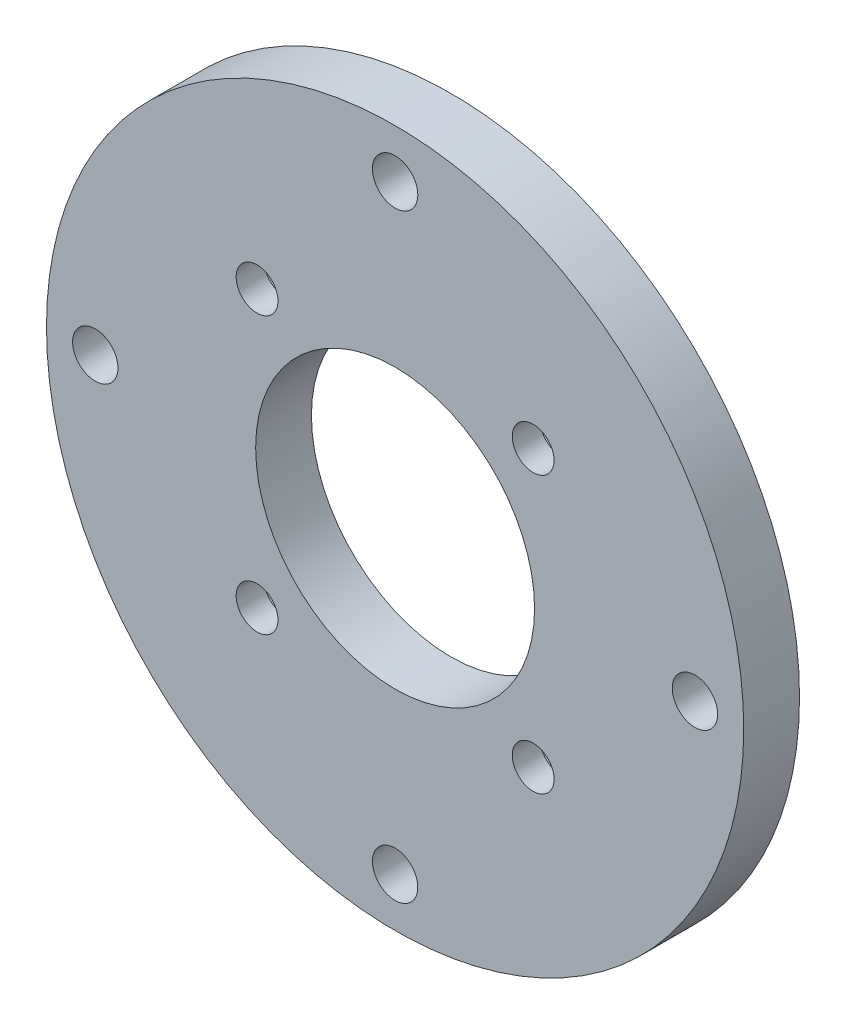
ISO-10303-21;
HEADER;
FILE_DESCRIPTION(('STEP AP214'),'2;1');
FILE_NAME('part.step','',(''),(''),'','','');
FILE_SCHEMA(('AUTOMOTIVE_DESIGN { 1 0 10303 214 1 1 1 1 }'));
ENDSEC;
DATA;
#1=APPLICATION_CONTEXT('core data for automotive mechanical design processes');
#2=APPLICATION_PROTOCOL_DEFINITION('international standard','automotive_design',2000,#1);
#3=PRODUCT_CONTEXT('',#1,'mechanical');
#4=PRODUCT('Part','Part','',(#3));
#5=PRODUCT_RELATED_PRODUCT_CATEGORY('part','',(#4));
#6=PRODUCT_DEFINITION_FORMATION('','',#4);
#7=PRODUCT_DEFINITION_CONTEXT('part definition',#1,'design');
#8=PRODUCT_DEFINITION('design','',#6,#7);
#9=PRODUCT_DEFINITION_SHAPE('','',#8);
#10=(LENGTH_UNIT() NAMED_UNIT(*) SI_UNIT(.MILLI.,.METRE.));
#11=(NAMED_UNIT(*) PLANE_ANGLE_UNIT() SI_UNIT($,.RADIAN.));
#12=(NAMED_UNIT(*) SI_UNIT($,.STERADIAN.) SOLID_ANGLE_UNIT());
#13=UNCERTAINTY_MEASURE_WITH_UNIT(LENGTH_MEASURE(1.E-05),#10,'distance_accuracy_value','');
#14=(GEOMETRIC_REPRESENTATION_CONTEXT(3) GLOBAL_UNCERTAINTY_ASSIGNED_CONTEXT((#13)) GLOBAL_UNIT_ASSIGNED_CONTEXT((#10,
#11,#12)) REPRESENTATION_CONTEXT('',''));
#15=CARTESIAN_POINT('',(0.,0.,0.));
#16=DIRECTION('',(0.,0.,1.));
#17=DIRECTION('',(1.,0.,0.));
#18=AXIS2_PLACEMENT_3D('',#15,#16,#17);
#19=CARTESIAN_POINT('',(0.,0.,20.));
#20=DIRECTION('',(0.,0.,-1.));
#21=DIRECTION('',(-1.,0.,0.));
#22=AXIS2_PLACEMENT_3D('',#19,#20,#21);
#23=CYLINDRICAL_SURFACE('',#22,125.);
#24=CARTESIAN_POINT('',(0.,0.,20.));
#25=DIRECTION('',(0.,0.,1.));
#26=DIRECTION('',(1.,0.,0.));
#27=AXIS2_PLACEMENT_3D('',#24,#25,#26);
#28=CIRCLE('',#27,125.);
#29=CARTESIAN_POINT('',(125.,0.,20.));
#30=VERTEX_POINT('',#29);
#31=EDGE_CURVE('E10',#30,#30,#28,.T.);
#32=ORIENTED_EDGE('',*,*,#31,.F.);
#33=EDGE_LOOP('',(#32));
#34=FACE_BOUND('',#33,.T.);
#35=CARTESIAN_POINT('',(0.,0.,0.));
#36=DIRECTION('',(0.,0.,1.));
#37=DIRECTION('',(1.,0.,0.));
#38=AXIS2_PLACEMENT_3D('',#35,#36,#37);
#39=CIRCLE('',#38,125.);
#40=CARTESIAN_POINT('',(125.,0.,0.));
#41=VERTEX_POINT('',#40);
#42=EDGE_CURVE('E35',#41,#41,#39,.T.);
#43=ORIENTED_EDGE('',*,*,#42,.T.);
#44=EDGE_LOOP('',(#43));
#45=FACE_BOUND('',#44,.T.);
#46=ADVANCED_FACE('F32',(#34,#45),#23,.T.);
#47=CARTESIAN_POINT('',(0.,0.,20.));
#48=DIRECTION('',(0.,0.,1.));
#49=DIRECTION('',(1.,0.,0.));
#50=AXIS2_PLACEMENT_3D('',#47,#48,#49);
#51=PLANE('',#50);
#52=CARTESIAN_POINT('',(-49.4974746830582,-49.4974746830585,20.));
#53=DIRECTION('',(0.,0.,-1.));
#54=DIRECTION('',(0.,-1.,0.));
#55=AXIS2_PLACEMENT_3D('',#52,#53,#54);
#56=CIRCLE('',#55,7.5);
#57=CARTESIAN_POINT('',(-49.4974746830581,-56.9974746830585,20.));
#58=VERTEX_POINT('',#57);
#59=EDGE_CURVE('E90',#58,#58,#56,.T.);
#60=ORIENTED_EDGE('',*,*,#59,.T.);
#61=EDGE_LOOP('',(#60));
#62=FACE_BOUND('',#61,.T.);
#63=CARTESIAN_POINT('',(49.4974746830583,-49.4974746830583,20.));
#64=DIRECTION('',(0.,0.,-1.));
#65=DIRECTION('',(1.,0.,0.));
#66=AXIS2_PLACEMENT_3D('',#63,#64,#65);
#67=CIRCLE('',#66,7.5);
#68=CARTESIAN_POINT('',(56.9974746830583,-49.4974746830583,20.));
#69=VERTEX_POINT('',#68);
#70=EDGE_CURVE('E113',#69,#69,#67,.T.);
#71=ORIENTED_EDGE('',*,*,#70,.T.);
#72=EDGE_LOOP('',(#71));
#73=FACE_BOUND('',#72,.T.);
#74=CARTESIAN_POINT('',(49.4974746830578,49.4974746830588,20.));
#75=DIRECTION('',(0.,0.,-1.));
#76=DIRECTION('',(0.,1.,0.));
#77=AXIS2_PLACEMENT_3D('',#74,#75,#76);
#78=CIRCLE('',#77,7.5);
#79=CARTESIAN_POINT('',(49.4974746830577,56.9974746830588,20.));
#80=VERTEX_POINT('',#79);
#81=EDGE_CURVE('E107',#80,#80,#78,.T.);
#82=ORIENTED_EDGE('',*,*,#81,.T.);
#83=EDGE_LOOP('',(#82));
#84=FACE_BOUND('',#83,.T.);
#85=CARTESIAN_POINT('',(-107.5,-3.75334243925637E-13,20.));
#86=DIRECTION('',(0.,0.,1.));
#87=DIRECTION('',(0.,1.,0.));
#88=AXIS2_PLACEMENT_3D('',#85,#86,#87);
#89=CIRCLE('',#88,8.1328201971002);
#90=CARTESIAN_POINT('',(-107.5,8.13282019709982,20.));
#91=VERTEX_POINT('',#90);
#92=EDGE_CURVE('E81',#91,#91,#89,.T.);
#93=ORIENTED_EDGE('',*,*,#92,.F.);
#94=EDGE_LOOP('',(#93));
#95=FACE_BOUND('',#94,.T.);
#96=CARTESIAN_POINT('',(0.,-107.5,20.));
#97=DIRECTION('',(0.,0.,1.));
#98=DIRECTION('',(-1.,0.,0.));
#99=AXIS2_PLACEMENT_3D('',#96,#97,#98);
#100=CIRCLE('',#99,8.1328201971002);
#101=CARTESIAN_POINT('',(-8.1328201971002,-107.5,20.));
#102=VERTEX_POINT('',#101);
#103=EDGE_CURVE('E75',#102,#102,#100,.T.);
#104=ORIENTED_EDGE('',*,*,#103,.F.);
#105=EDGE_LOOP('',(#104));
#106=FACE_BOUND('',#105,.T.);
#107=CARTESIAN_POINT('',(107.5,1.12600273177691E-12,20.));
#108=DIRECTION('',(0.,0.,1.));
#109=DIRECTION('',(0.,-1.,0.));
#110=AXIS2_PLACEMENT_3D('',#107,#108,#109);
#111=CIRCLE('',#110,8.1328201971002);
#112=CARTESIAN_POINT('',(107.5,-8.13282019709907,20.));
#113=VERTEX_POINT('',#112);
#114=EDGE_CURVE('E68',#113,#113,#111,.T.);
#115=ORIENTED_EDGE('',*,*,#114,.F.);
#116=EDGE_LOOP('',(#115));
#117=FACE_BOUND('',#116,.T.);
#118=CARTESIAN_POINT('',(-49.4974746830583,49.4974746830583,20.));
#119=DIRECTION('',(0.,0.,-1.));
#120=DIRECTION('',(-1.,0.,0.));
#121=AXIS2_PLACEMENT_3D('',#118,#119,#120);
#122=CIRCLE('',#121,7.5);
#123=CARTESIAN_POINT('',(-56.9974746830583,49.4974746830583,20.));
#124=VERTEX_POINT('',#123);
#125=EDGE_CURVE('E59',#124,#124,#122,.T.);
#126=ORIENTED_EDGE('',*,*,#125,.T.);
#127=EDGE_LOOP('',(#126));
#128=FACE_BOUND('',#127,.T.);
#129=CARTESIAN_POINT('',(0.,107.5,20.));
#130=DIRECTION('',(0.,0.,1.));
#131=DIRECTION('',(1.,0.,0.));
#132=AXIS2_PLACEMENT_3D('',#129,#130,#131);
#133=CIRCLE('',#132,8.1328201971002);
#134=CARTESIAN_POINT('',(8.1328201971002,107.5,20.));
#135=VERTEX_POINT('',#134);
#136=EDGE_CURVE('E50',#135,#135,#133,.T.);
#137=ORIENTED_EDGE('',*,*,#136,.F.);
#138=EDGE_LOOP('',(#137));
#139=FACE_BOUND('',#138,.T.);
#140=CARTESIAN_POINT('',(0.,0.,20.));
#141=DIRECTION('',(0.,0.,1.));
#142=DIRECTION('',(1.,0.,0.));
#143=AXIS2_PLACEMENT_3D('',#140,#141,#142);
#144=CIRCLE('',#143,50.);
#145=CARTESIAN_POINT('',(50.,0.,20.));
#146=VERTEX_POINT('',#145);
#147=EDGE_CURVE('E44',#146,#146,#144,.T.);
#148=ORIENTED_EDGE('',*,*,#147,.F.);
#149=EDGE_LOOP('',(#148));
#150=FACE_BOUND('',#149,.T.);
#151=ORIENTED_EDGE('',*,*,#31,.T.);
#152=EDGE_LOOP('',(#151));
#153=FACE_BOUND('',#152,.T.);
#154=ADVANCED_FACE('F122',(#62,#73,#84,#95,#106,#117,#128,#139,#150,#153),#51,.T.);
#155=CARTESIAN_POINT('',(0.,0.,0.));
#156=DIRECTION('',(0.,0.,1.));
#157=DIRECTION('',(1.,0.,0.));
#158=AXIS2_PLACEMENT_3D('',#155,#156,#157);
#159=PLANE('',#158);
#160=CARTESIAN_POINT('',(-49.4974746830582,-49.4974746830585,0.));
#161=DIRECTION('',(0.,0.,-1.));
#162=DIRECTION('',(0.,-1.,0.));
#163=AXIS2_PLACEMENT_3D('',#160,#161,#162);
#164=CIRCLE('',#163,15.);
#165=CARTESIAN_POINT('',(-49.4974746830581,-64.4974746830585,0.));
#166=VERTEX_POINT('',#165);
#167=EDGE_CURVE('E99',#166,#166,#164,.T.);
#168=ORIENTED_EDGE('',*,*,#167,.F.);
#169=EDGE_LOOP('',(#168));
#170=FACE_BOUND('',#169,.T.);
#171=CARTESIAN_POINT('',(49.4974746830583,-49.4974746830583,0.));
#172=DIRECTION('',(0.,0.,-1.));
#173=DIRECTION('',(1.,0.,0.));
#174=AXIS2_PLACEMENT_3D('',#171,#172,#173);
#175=CIRCLE('',#174,15.);
#176=CARTESIAN_POINT('',(64.4974746830583,-49.4974746830583,0.));
#177=VERTEX_POINT('',#176);
#178=EDGE_CURVE('E93',#177,#177,#175,.T.);
#179=ORIENTED_EDGE('',*,*,#178,.F.);
#180=EDGE_LOOP('',(#179));
#181=FACE_BOUND('',#180,.T.);
#182=CARTESIAN_POINT('',(49.4974746830578,49.4974746830588,0.));
#183=DIRECTION('',(0.,0.,-1.));
#184=DIRECTION('',(0.,1.,0.));
#185=AXIS2_PLACEMENT_3D('',#182,#183,#184);
#186=CIRCLE('',#185,15.);
#187=CARTESIAN_POINT('',(49.4974746830577,64.4974746830589,0.));
#188=VERTEX_POINT('',#187);
#189=EDGE_CURVE('E86',#188,#188,#186,.T.);
#190=ORIENTED_EDGE('',*,*,#189,.F.);
#191=EDGE_LOOP('',(#190));
#192=FACE_BOUND('',#191,.T.);
#193=CARTESIAN_POINT('',(-107.5,-3.75334243925637E-13,0.));
#194=DIRECTION('',(0.,0.,1.));
#195=DIRECTION('',(0.,1.,0.));
#196=AXIS2_PLACEMENT_3D('',#193,#194,#195);
#197=CIRCLE('',#196,8.1328201971002);
#198=CARTESIAN_POINT('',(-107.5,8.13282019709982,0.));
#199=VERTEX_POINT('',#198);
#200=EDGE_CURVE('E65',#199,#199,#197,.T.);
#201=ORIENTED_EDGE('',*,*,#200,.T.);
#202=EDGE_LOOP('',(#201));
#203=FACE_BOUND('',#202,.T.);
#204=CARTESIAN_POINT('',(0.,-107.5,0.));
#205=DIRECTION('',(0.,0.,1.));
#206=DIRECTION('',(-1.,0.,0.));
#207=AXIS2_PLACEMENT_3D('',#204,#205,#206);
#208=CIRCLE('',#207,8.1328201971002);
#209=CARTESIAN_POINT('',(-8.1328201971002,-107.5,0.));
#210=VERTEX_POINT('',#209);
#211=EDGE_CURVE('E78',#210,#210,#208,.T.);
#212=ORIENTED_EDGE('',*,*,#211,.T.);
#213=EDGE_LOOP('',(#212));
#214=FACE_BOUND('',#213,.T.);
#215=CARTESIAN_POINT('',(107.5,1.12600273177691E-12,0.));
#216=DIRECTION('',(0.,0.,1.));
#217=DIRECTION('',(0.,-1.,0.));
#218=AXIS2_PLACEMENT_3D('',#215,#216,#217);
#219=CIRCLE('',#218,8.1328201971002);
#220=CARTESIAN_POINT('',(107.5,-8.13282019709907,0.));
#221=VERTEX_POINT('',#220);
#222=EDGE_CURVE('E71',#221,#221,#219,.T.);
#223=ORIENTED_EDGE('',*,*,#222,.T.);
#224=EDGE_LOOP('',(#223));
#225=FACE_BOUND('',#224,.T.);
#226=CARTESIAN_POINT('',(-49.4974746830583,49.4974746830583,0.));
#227=DIRECTION('',(0.,0.,-1.));
#228=DIRECTION('',(-1.,0.,0.));
#229=AXIS2_PLACEMENT_3D('',#226,#227,#228);
#230=CIRCLE('',#229,15.);
#231=CARTESIAN_POINT('',(-64.4974746830583,49.4974746830583,0.));
#232=VERTEX_POINT('',#231);
#233=EDGE_CURVE('E56',#232,#232,#230,.T.);
#234=ORIENTED_EDGE('',*,*,#233,.F.);
#235=EDGE_LOOP('',(#234));
#236=FACE_BOUND('',#235,.T.);
#237=CARTESIAN_POINT('',(0.,107.5,0.));
#238=DIRECTION('',(0.,0.,1.));
#239=DIRECTION('',(1.,0.,0.));
#240=AXIS2_PLACEMENT_3D('',#237,#238,#239);
#241=CIRCLE('',#240,8.1328201971002);
#242=CARTESIAN_POINT('',(8.1328201971002,107.5,0.));
#243=VERTEX_POINT('',#242);
#244=EDGE_CURVE('E47',#243,#243,#241,.T.);
#245=ORIENTED_EDGE('',*,*,#244,.T.);
#246=EDGE_LOOP('',(#245));
#247=FACE_BOUND('',#246,.T.);
#248=CARTESIAN_POINT('',(0.,0.,0.));
#249=DIRECTION('',(0.,0.,1.));
#250=DIRECTION('',(1.,0.,0.));
#251=AXIS2_PLACEMENT_3D('',#248,#249,#250);
#252=CIRCLE('',#251,50.);
#253=CARTESIAN_POINT('',(50.,0.,0.));
#254=VERTEX_POINT('',#253);
#255=EDGE_CURVE('E42',#254,#254,#252,.T.);
#256=ORIENTED_EDGE('',*,*,#255,.T.);
#257=EDGE_LOOP('',(#256));
#258=FACE_BOUND('',#257,.T.);
#259=ORIENTED_EDGE('',*,*,#42,.F.);
#260=EDGE_LOOP('',(#259));
#261=FACE_BOUND('',#260,.T.);
#262=ADVANCED_FACE('F146',(#170,#181,#192,#203,#214,#225,#236,#247,#258,#261),#159,.F.);
#263=CARTESIAN_POINT('',(0.,0.,0.));
#264=DIRECTION('',(0.,0.,1.));
#265=DIRECTION('',(1.,0.,0.));
#266=AXIS2_PLACEMENT_3D('',#263,#264,#265);
#267=CYLINDRICAL_SURFACE('',#266,50.);
#268=ORIENTED_EDGE('',*,*,#255,.F.);
#269=EDGE_LOOP('',(#268));
#270=FACE_BOUND('',#269,.T.);
#271=ORIENTED_EDGE('',*,*,#147,.T.);
#272=EDGE_LOOP('',(#271));
#273=FACE_BOUND('',#272,.T.);
#274=ADVANCED_FACE('F149',(#270,#273),#267,.F.);
#275=CARTESIAN_POINT('',(0.,107.5,0.));
#276=DIRECTION('',(0.,0.,1.));
#277=DIRECTION('',(1.,0.,0.));
#278=AXIS2_PLACEMENT_3D('',#275,#276,#277);
#279=CYLINDRICAL_SURFACE('',#278,8.1328201971002);
#280=ORIENTED_EDGE('',*,*,#244,.F.);
#281=EDGE_LOOP('',(#280));
#282=FACE_BOUND('',#281,.T.);
#283=ORIENTED_EDGE('',*,*,#136,.T.);
#284=EDGE_LOOP('',(#283));
#285=FACE_BOUND('',#284,.T.);
#286=ADVANCED_FACE('F179',(#282,#285),#279,.F.);
#287=CARTESIAN_POINT('',(-49.4974746830583,49.4974746830583,10.));
#288=DIRECTION('',(0.,0.,-1.));
#289=DIRECTION('',(-1.,0.,0.));
#290=AXIS2_PLACEMENT_3D('',#287,#288,#289);
#291=CYLINDRICAL_SURFACE('',#290,15.);
#292=CARTESIAN_POINT('',(-49.4974746830583,49.4974746830583,10.));
#293=DIRECTION('',(0.,0.,-1.));
#294=DIRECTION('',(-1.,0.,0.));
#295=AXIS2_PLACEMENT_3D('',#292,#293,#294);
#296=CIRCLE('',#295,15.);
#297=CARTESIAN_POINT('',(-64.4974746830583,49.4974746830583,10.));
#298=VERTEX_POINT('',#297);
#299=EDGE_CURVE('E53',#298,#298,#296,.T.);
#300=ORIENTED_EDGE('',*,*,#299,.F.);
#301=EDGE_LOOP('',(#300));
#302=FACE_BOUND('',#301,.T.);
#303=ORIENTED_EDGE('',*,*,#233,.T.);
#304=EDGE_LOOP('',(#303));
#305=FACE_BOUND('',#304,.T.);
#306=ADVANCED_FACE('F183',(#302,#305),#291,.F.);
#307=CARTESIAN_POINT('',(-49.4974746830583,49.4974746830583,10.));
#308=DIRECTION('',(0.,0.,-1.));
#309=DIRECTION('',(-1.,0.,0.));
#310=AXIS2_PLACEMENT_3D('',#307,#308,#309);
#311=PLANE('',#310);
#312=CARTESIAN_POINT('',(-49.4974746830583,49.4974746830583,10.));
#313=DIRECTION('',(0.,0.,-1.));
#314=DIRECTION('',(-1.,0.,0.));
#315=AXIS2_PLACEMENT_3D('',#312,#313,#314);
#316=CIRCLE('',#315,7.5);
#317=CARTESIAN_POINT('',(-56.9974746830583,49.4974746830583,10.));
#318=VERTEX_POINT('',#317);
#319=EDGE_CURVE('E62',#318,#318,#316,.T.);
#320=ORIENTED_EDGE('',*,*,#319,.F.);
#321=EDGE_LOOP('',(#320));
#322=FACE_BOUND('',#321,.T.);
#323=ORIENTED_EDGE('',*,*,#299,.T.);
#324=EDGE_LOOP('',(#323));
#325=FACE_BOUND('',#324,.T.);
#326=ADVANCED_FACE('F187',(#322,#325),#311,.T.);
#327=CARTESIAN_POINT('',(-49.4974746830583,49.4974746830583,20.));
#328=DIRECTION('',(0.,0.,-1.));
#329=DIRECTION('',(-1.,0.,0.));
#330=AXIS2_PLACEMENT_3D('',#327,#328,#329);
#331=CYLINDRICAL_SURFACE('',#330,7.5);
#332=ORIENTED_EDGE('',*,*,#125,.F.);
#333=EDGE_LOOP('',(#332));
#334=FACE_BOUND('',#333,.T.);
#335=ORIENTED_EDGE('',*,*,#319,.T.);
#336=EDGE_LOOP('',(#335));
#337=FACE_BOUND('',#336,.T.);
#338=ADVANCED_FACE('F191',(#334,#337),#331,.F.);
#339=CARTESIAN_POINT('',(107.5,1.12600273177691E-12,0.));
#340=DIRECTION('',(0.,0.,1.));
#341=DIRECTION('',(1.,0.,0.));
#342=AXIS2_PLACEMENT_3D('',#339,#340,#341);
#343=CYLINDRICAL_SURFACE('',#342,8.1328201971002);
#344=ORIENTED_EDGE('',*,*,#222,.F.);
#345=EDGE_LOOP('',(#344));
#346=FACE_BOUND('',#345,.T.);
#347=ORIENTED_EDGE('',*,*,#114,.T.);
#348=EDGE_LOOP('',(#347));
#349=FACE_BOUND('',#348,.T.);
#350=ADVANCED_FACE('F195',(#346,#349),#343,.F.);
#351=CARTESIAN_POINT('',(0.,-107.5,0.));
#352=DIRECTION('',(0.,0.,1.));
#353=DIRECTION('',(1.,0.,0.));
#354=AXIS2_PLACEMENT_3D('',#351,#352,#353);
#355=CYLINDRICAL_SURFACE('',#354,8.1328201971002);
#356=ORIENTED_EDGE('',*,*,#211,.F.);
#357=EDGE_LOOP('',(#356));
#358=FACE_BOUND('',#357,.T.);
#359=ORIENTED_EDGE('',*,*,#103,.T.);
#360=EDGE_LOOP('',(#359));
#361=FACE_BOUND('',#360,.T.);
#362=ADVANCED_FACE('F199',(#358,#361),#355,.F.);
#363=CARTESIAN_POINT('',(-107.5,-3.75334243925637E-13,0.));
#364=DIRECTION('',(0.,0.,1.));
#365=DIRECTION('',(1.,0.,0.));
#366=AXIS2_PLACEMENT_3D('',#363,#364,#365);
#367=CYLINDRICAL_SURFACE('',#366,8.1328201971002);
#368=ORIENTED_EDGE('',*,*,#200,.F.);
#369=EDGE_LOOP('',(#368));
#370=FACE_BOUND('',#369,.T.);
#371=ORIENTED_EDGE('',*,*,#92,.T.);
#372=EDGE_LOOP('',(#371));
#373=FACE_BOUND('',#372,.T.);
#374=ADVANCED_FACE('F203',(#370,#373),#367,.F.);
#375=CARTESIAN_POINT('',(49.4974746830578,49.4974746830588,10.));
#376=DIRECTION('',(0.,0.,-1.));
#377=DIRECTION('',(-1.,0.,0.));
#378=AXIS2_PLACEMENT_3D('',#375,#376,#377);
#379=CYLINDRICAL_SURFACE('',#378,15.);
#380=CARTESIAN_POINT('',(49.4974746830578,49.4974746830588,10.));
#381=DIRECTION('',(0.,0.,-1.));
#382=DIRECTION('',(0.,1.,0.));
#383=AXIS2_PLACEMENT_3D('',#380,#381,#382);
#384=CIRCLE('',#383,15.);
#385=CARTESIAN_POINT('',(49.4974746830577,64.4974746830589,10.));
#386=VERTEX_POINT('',#385);
#387=EDGE_CURVE('E89',#386,#386,#384,.T.);
#388=ORIENTED_EDGE('',*,*,#387,.F.);
#389=EDGE_LOOP('',(#388));
#390=FACE_BOUND('',#389,.T.);
#391=ORIENTED_EDGE('',*,*,#189,.T.);
#392=EDGE_LOOP('',(#391));
#393=FACE_BOUND('',#392,.T.);
#394=ADVANCED_FACE('F207',(#390,#393),#379,.F.);
#395=CARTESIAN_POINT('',(49.4974746830578,49.4974746830588,10.));
#396=DIRECTION('',(0.,0.,-1.));
#397=DIRECTION('',(0.,1.,0.));
#398=AXIS2_PLACEMENT_3D('',#395,#396,#397);
#399=PLANE('',#398);
#400=CARTESIAN_POINT('',(49.4974746830578,49.4974746830588,10.));
#401=DIRECTION('',(0.,0.,-1.));
#402=DIRECTION('',(0.,1.,0.));
#403=AXIS2_PLACEMENT_3D('',#400,#401,#402);
#404=CIRCLE('',#403,7.5);
#405=CARTESIAN_POINT('',(49.4974746830577,56.9974746830588,10.));
#406=VERTEX_POINT('',#405);
#407=EDGE_CURVE('E104',#406,#406,#404,.T.);
#408=ORIENTED_EDGE('',*,*,#407,.F.);
#409=EDGE_LOOP('',(#408));
#410=FACE_BOUND('',#409,.T.);
#411=ORIENTED_EDGE('',*,*,#387,.T.);
#412=EDGE_LOOP('',(#411));
#413=FACE_BOUND('',#412,.T.);
#414=ADVANCED_FACE('F211',(#410,#413),#399,.T.);
#415=CARTESIAN_POINT('',(49.4974746830583,-49.4974746830583,10.));
#416=DIRECTION('',(0.,0.,-1.));
#417=DIRECTION('',(-1.,0.,0.));
#418=AXIS2_PLACEMENT_3D('',#415,#416,#417);
#419=CYLINDRICAL_SURFACE('',#418,15.);
#420=CARTESIAN_POINT('',(49.4974746830583,-49.4974746830583,10.));
#421=DIRECTION('',(0.,0.,-1.));
#422=DIRECTION('',(1.,0.,0.));
#423=AXIS2_PLACEMENT_3D('',#420,#421,#422);
#424=CIRCLE('',#423,15.);
#425=CARTESIAN_POINT('',(64.4974746830583,-49.4974746830583,10.));
#426=VERTEX_POINT('',#425);
#427=EDGE_CURVE('E96',#426,#426,#424,.T.);
#428=ORIENTED_EDGE('',*,*,#427,.F.);
#429=EDGE_LOOP('',(#428));
#430=FACE_BOUND('',#429,.T.);
#431=ORIENTED_EDGE('',*,*,#178,.T.);
#432=EDGE_LOOP('',(#431));
#433=FACE_BOUND('',#432,.T.);
#434=ADVANCED_FACE('F215',(#430,#433),#419,.F.);
#435=CARTESIAN_POINT('',(49.4974746830583,-49.4974746830583,10.));
#436=DIRECTION('',(0.,0.,-1.));
#437=DIRECTION('',(1.,0.,0.));
#438=AXIS2_PLACEMENT_3D('',#435,#436,#437);
#439=PLANE('',#438);
#440=CARTESIAN_POINT('',(49.4974746830583,-49.4974746830583,10.));
#441=DIRECTION('',(0.,0.,-1.));
#442=DIRECTION('',(1.,0.,0.));
#443=AXIS2_PLACEMENT_3D('',#440,#441,#442);
#444=CIRCLE('',#443,7.5);
#445=CARTESIAN_POINT('',(56.9974746830583,-49.4974746830583,10.));
#446=VERTEX_POINT('',#445);
#447=EDGE_CURVE('E110',#446,#446,#444,.T.);
#448=ORIENTED_EDGE('',*,*,#447,.F.);
#449=EDGE_LOOP('',(#448));
#450=FACE_BOUND('',#449,.T.);
#451=ORIENTED_EDGE('',*,*,#427,.T.);
#452=EDGE_LOOP('',(#451));
#453=FACE_BOUND('',#452,.T.);
#454=ADVANCED_FACE('F142',(#450,#453),#439,.T.);
#455=CARTESIAN_POINT('',(-49.4974746830582,-49.4974746830585,10.));
#456=DIRECTION('',(0.,0.,-1.));
#457=DIRECTION('',(-1.,0.,0.));
#458=AXIS2_PLACEMENT_3D('',#455,#456,#457);
#459=CYLINDRICAL_SURFACE('',#458,15.);
#460=CARTESIAN_POINT('',(-49.4974746830582,-49.4974746830585,10.));
#461=DIRECTION('',(0.,0.,-1.));
#462=DIRECTION('',(0.,-1.,0.));
#463=AXIS2_PLACEMENT_3D('',#460,#461,#462);
#464=CIRCLE('',#463,15.);
#465=CARTESIAN_POINT('',(-49.4974746830581,-64.4974746830585,10.));
#466=VERTEX_POINT('',#465);
#467=EDGE_CURVE('E72',#466,#466,#464,.T.);
#468=ORIENTED_EDGE('',*,*,#467,.F.);
#469=EDGE_LOOP('',(#468));
#470=FACE_BOUND('',#469,.T.);
#471=ORIENTED_EDGE('',*,*,#167,.T.);
#472=EDGE_LOOP('',(#471));
#473=FACE_BOUND('',#472,.T.);
#474=ADVANCED_FACE('F136',(#470,#473),#459,.F.);
#475=CARTESIAN_POINT('',(-49.4974746830582,-49.4974746830585,10.));
#476=DIRECTION('',(0.,0.,-1.));
#477=DIRECTION('',(0.,-1.,0.));
#478=AXIS2_PLACEMENT_3D('',#475,#476,#477);
#479=PLANE('',#478);
#480=CARTESIAN_POINT('',(-49.4974746830582,-49.4974746830585,10.));
#481=DIRECTION('',(0.,0.,-1.));
#482=DIRECTION('',(0.,-1.,0.));
#483=AXIS2_PLACEMENT_3D('',#480,#481,#482);
#484=CIRCLE('',#483,7.5);
#485=CARTESIAN_POINT('',(-49.4974746830581,-56.9974746830585,10.));
#486=VERTEX_POINT('',#485);
#487=EDGE_CURVE('E116',#486,#486,#484,.T.);
#488=ORIENTED_EDGE('',*,*,#487,.F.);
#489=EDGE_LOOP('',(#488));
#490=FACE_BOUND('',#489,.T.);
#491=ORIENTED_EDGE('',*,*,#467,.T.);
#492=EDGE_LOOP('',(#491));
#493=FACE_BOUND('',#492,.T.);
#494=ADVANCED_FACE('F132',(#490,#493),#479,.T.);
#495=CARTESIAN_POINT('',(49.4974746830578,49.4974746830588,20.));
#496=DIRECTION('',(0.,0.,-1.));
#497=DIRECTION('',(-1.,0.,0.));
#498=AXIS2_PLACEMENT_3D('',#495,#496,#497);
#499=CYLINDRICAL_SURFACE('',#498,7.5);
#500=ORIENTED_EDGE('',*,*,#81,.F.);
#501=EDGE_LOOP('',(#500));
#502=FACE_BOUND('',#501,.T.);
#503=ORIENTED_EDGE('',*,*,#407,.T.);
#504=EDGE_LOOP('',(#503));
#505=FACE_BOUND('',#504,.T.);
#506=ADVANCED_FACE('F135',(#502,#505),#499,.F.);
#507=CARTESIAN_POINT('',(49.4974746830583,-49.4974746830583,20.));
#508=DIRECTION('',(0.,0.,-1.));
#509=DIRECTION('',(-1.,0.,0.));
#510=AXIS2_PLACEMENT_3D('',#507,#508,#509);
#511=CYLINDRICAL_SURFACE('',#510,7.5);
#512=ORIENTED_EDGE('',*,*,#70,.F.);
#513=EDGE_LOOP('',(#512));
#514=FACE_BOUND('',#513,.T.);
#515=ORIENTED_EDGE('',*,*,#447,.T.);
#516=EDGE_LOOP('',(#515));
#517=FACE_BOUND('',#516,.T.);
#518=ADVANCED_FACE('F128',(#514,#517),#511,.F.);
#519=CARTESIAN_POINT('',(-49.4974746830582,-49.4974746830585,20.));
#520=DIRECTION('',(0.,0.,-1.));
#521=DIRECTION('',(-1.,0.,0.));
#522=AXIS2_PLACEMENT_3D('',#519,#520,#521);
#523=CYLINDRICAL_SURFACE('',#522,7.5);
#524=ORIENTED_EDGE('',*,*,#59,.F.);
#525=EDGE_LOOP('',(#524));
#526=FACE_BOUND('',#525,.T.);
#527=ORIENTED_EDGE('',*,*,#487,.T.);
#528=EDGE_LOOP('',(#527));
#529=FACE_BOUND('',#528,.T.);
#530=ADVANCED_FACE('F125',(#526,#529),#523,.F.);
#531=CLOSED_SHELL('',(#46,#154,#262,#274,#286,#306,#326,#338,#350,#362,#374,#394,#414,#434,#454,
#474,#494,#506,#518,#530));
#532=MANIFOLD_SOLID_BREP('B2',#531);
#533=ADVANCED_BREP_SHAPE_REPRESENTATION('',(#18,#532),#14);
#534=SHAPE_DEFINITION_REPRESENTATION(#9,#533);
ENDSEC;
END-ISO-10303-21;
